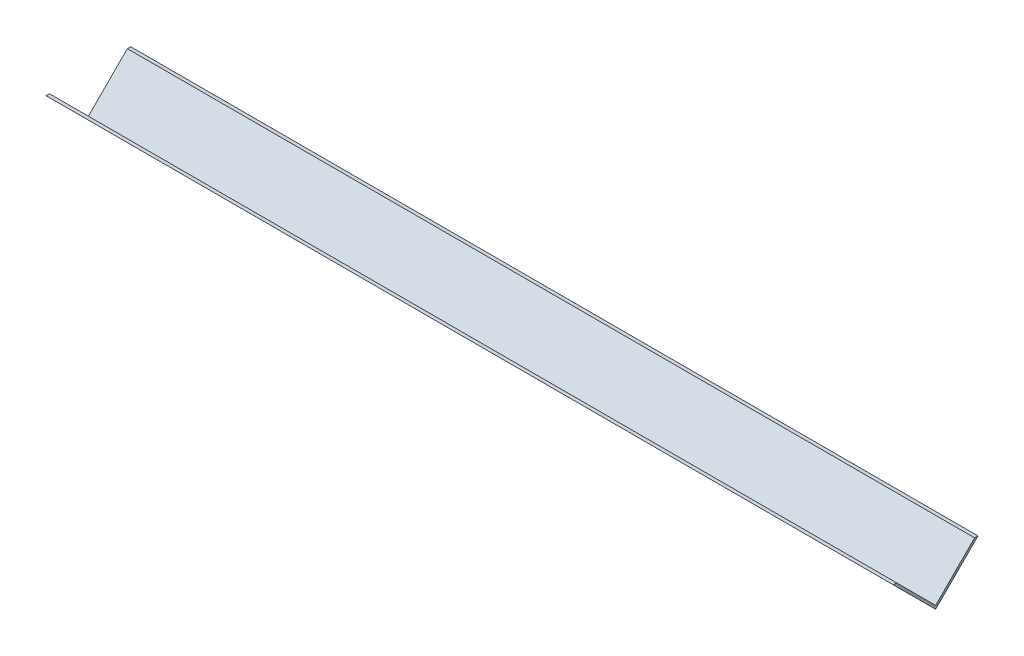
ISO-10303-21;
HEADER;
FILE_DESCRIPTION(('STEP AP214'),'2;1');
FILE_NAME('part.step','',(''),(''),'','','');
FILE_SCHEMA(('AUTOMOTIVE_DESIGN { 1 0 10303 214 1 1 1 1 }'));
ENDSEC;
DATA;
#1=APPLICATION_CONTEXT('core data for automotive mechanical design processes');
#2=APPLICATION_PROTOCOL_DEFINITION('international standard','automotive_design',2000,#1);
#3=PRODUCT_CONTEXT('',#1,'mechanical');
#4=PRODUCT('Part','Part','',(#3));
#5=PRODUCT_RELATED_PRODUCT_CATEGORY('part','',(#4));
#6=PRODUCT_DEFINITION_FORMATION('','',#4);
#7=PRODUCT_DEFINITION_CONTEXT('part definition',#1,'design');
#8=PRODUCT_DEFINITION('design','',#6,#7);
#9=PRODUCT_DEFINITION_SHAPE('','',#8);
#10=(LENGTH_UNIT() NAMED_UNIT(*) SI_UNIT(.MILLI.,.METRE.));
#11=(NAMED_UNIT(*) PLANE_ANGLE_UNIT() SI_UNIT($,.RADIAN.));
#12=(NAMED_UNIT(*) SI_UNIT($,.STERADIAN.) SOLID_ANGLE_UNIT());
#13=UNCERTAINTY_MEASURE_WITH_UNIT(LENGTH_MEASURE(1.E-05),#10,'distance_accuracy_value','');
#14=(GEOMETRIC_REPRESENTATION_CONTEXT(3) GLOBAL_UNCERTAINTY_ASSIGNED_CONTEXT((#13)) GLOBAL_UNIT_ASSIGNED_CONTEXT((#10,
#11,#12)) REPRESENTATION_CONTEXT('',''));
#15=CARTESIAN_POINT('',(0.,0.,0.));
#16=DIRECTION('',(0.,0.,1.));
#17=DIRECTION('',(1.,0.,0.));
#18=AXIS2_PLACEMENT_3D('',#15,#16,#17);
#19=CARTESIAN_POINT('',(400.,0.,0.));
#20=DIRECTION('',(0.,0.707106781186549,0.707106781186546));
#21=DIRECTION('',(0.,-0.707106781186546,0.707106781186549));
#22=AXIS2_PLACEMENT_3D('',#19,#20,#21);
#23=PLANE('',#22);
#24=DIRECTION('',(0.,0.707106781186546,-0.707106781186549));
#25=VECTOR('',#24,1.);
#26=CARTESIAN_POINT('',(0.,0.,0.));
#27=LINE('',#26,#25);
#28=CARTESIAN_POINT('',(0.,0.,0.));
#29=VERTEX_POINT('',#28);
#30=CARTESIAN_POINT('',(0.,20.,-20.0000000000001));
#31=VERTEX_POINT('',#30);
#32=EDGE_CURVE('E117',#29,#31,#27,.T.);
#33=ORIENTED_EDGE('',*,*,#32,.T.);
#34=DIRECTION('',(-1.,0.,0.));
#35=VECTOR('',#34,1.);
#36=CARTESIAN_POINT('',(400.,20.,-20.0000000000001));
#37=LINE('',#36,#35);
#38=CARTESIAN_POINT('',(400.,20.,-20.0000000000001));
#39=VERTEX_POINT('',#38);
#40=EDGE_CURVE('E11',#39,#31,#37,.T.);
#41=ORIENTED_EDGE('',*,*,#40,.F.);
#42=DIRECTION('',(0.,0.707106781186546,-0.707106781186549));
#43=VECTOR('',#42,1.);
#44=CARTESIAN_POINT('',(400.,0.,0.));
#45=LINE('',#44,#43);
#46=CARTESIAN_POINT('',(400.,0.,0.));
#47=VERTEX_POINT('',#46);
#48=EDGE_CURVE('E127',#47,#39,#45,.T.);
#49=ORIENTED_EDGE('',*,*,#48,.F.);
#50=DIRECTION('',(-1.,0.,0.));
#51=VECTOR('',#50,1.);
#52=CARTESIAN_POINT('',(400.,0.,0.));
#53=LINE('',#52,#51);
#54=EDGE_CURVE('E113',#47,#29,#53,.T.);
#55=ORIENTED_EDGE('',*,*,#54,.T.);
#56=EDGE_LOOP('',(#33,#41,#49,#55));
#57=FACE_BOUND('',#56,.T.);
#58=ADVANCED_FACE('F33',(#57),#23,.F.);
#59=CARTESIAN_POINT('',(400.,20.,-20.0000000000001));
#60=DIRECTION('',(0.,-1.,0.));
#61=DIRECTION('',(0.,0.,-1.));
#62=AXIS2_PLACEMENT_3D('',#59,#60,#61);
#63=PLANE('',#62);
#64=DIRECTION('',(0.,0.,1.));
#65=VECTOR('',#64,1.);
#66=CARTESIAN_POINT('',(0.,20.,-20.0000000000001));
#67=LINE('',#66,#65);
#68=CARTESIAN_POINT('',(0.,20.,-18.4051617191672));
#69=VERTEX_POINT('',#68);
#70=EDGE_CURVE('E120',#31,#69,#67,.T.);
#71=ORIENTED_EDGE('',*,*,#70,.T.);
#72=DIRECTION('',(-1.,0.,0.));
#73=VECTOR('',#72,1.);
#74=CARTESIAN_POINT('',(400.,20.,-18.4051617191672));
#75=LINE('',#74,#73);
#76=CARTESIAN_POINT('',(400.,20.,-18.4051617191672));
#77=VERTEX_POINT('',#76);
#78=EDGE_CURVE('E41',#77,#69,#75,.T.);
#79=ORIENTED_EDGE('',*,*,#78,.F.);
#80=DIRECTION('',(0.,0.,1.));
#81=VECTOR('',#80,1.);
#82=CARTESIAN_POINT('',(400.,20.,-20.0000000000001));
#83=LINE('',#82,#81);
#84=EDGE_CURVE('E86',#39,#77,#83,.T.);
#85=ORIENTED_EDGE('',*,*,#84,.F.);
#86=ORIENTED_EDGE('',*,*,#40,.T.);
#87=EDGE_LOOP('',(#71,#79,#85,#86));
#88=FACE_BOUND('',#87,.T.);
#89=ADVANCED_FACE('F151',(#88),#63,.F.);
#90=CARTESIAN_POINT('',(400.,20.,-18.4051617191672));
#91=DIRECTION('',(0.,-0.707106781186549,-0.707106781186546));
#92=DIRECTION('',(0.,0.707106781186546,-0.707106781186549));
#93=AXIS2_PLACEMENT_3D('',#90,#91,#92);
#94=PLANE('',#93);
#95=DIRECTION('',(0.,-0.707106781186546,0.707106781186549));
#96=VECTOR('',#95,1.);
#97=CARTESIAN_POINT('',(0.,20.,-18.4051617191672));
#98=LINE('',#97,#96);
#99=CARTESIAN_POINT('',(0.,1.59483828083292,0.));
#100=VERTEX_POINT('',#99);
#101=EDGE_CURVE('E122',#69,#100,#98,.T.);
#102=ORIENTED_EDGE('',*,*,#101,.T.);
#103=DIRECTION('',(-1.,0.,0.));
#104=VECTOR('',#103,1.);
#105=CARTESIAN_POINT('',(400.,1.59483828083292,0.));
#106=LINE('',#105,#104);
#107=CARTESIAN_POINT('',(400.,1.59483828083292,0.));
#108=VERTEX_POINT('',#107);
#109=EDGE_CURVE('E108',#108,#100,#106,.T.);
#110=ORIENTED_EDGE('',*,*,#109,.F.);
#111=DIRECTION('',(0.,-0.707106781186546,0.707106781186549));
#112=VECTOR('',#111,1.);
#113=CARTESIAN_POINT('',(400.,20.,-18.4051617191672));
#114=LINE('',#113,#112);
#115=EDGE_CURVE('E99',#77,#108,#114,.T.);
#116=ORIENTED_EDGE('',*,*,#115,.F.);
#117=ORIENTED_EDGE('',*,*,#78,.T.);
#118=EDGE_LOOP('',(#102,#110,#116,#117));
#119=FACE_BOUND('',#118,.T.);
#120=ADVANCED_FACE('F133',(#119),#94,.F.);
#121=CARTESIAN_POINT('',(400.,20.,18.4051617191672));
#122=DIRECTION('',(0.,-0.707106781186549,0.707106781186546));
#123=DIRECTION('',(0.,-0.707106781186546,-0.707106781186549));
#124=AXIS2_PLACEMENT_3D('',#121,#122,#123);
#125=PLANE('',#124);
#126=DIRECTION('',(0.,0.707106781186546,0.707106781186549));
#127=VECTOR('',#126,1.);
#128=CARTESIAN_POINT('',(0.,20.,18.4051617191672));
#129=LINE('',#128,#127);
#130=CARTESIAN_POINT('',(0.,20.,18.4051617191672));
#131=VERTEX_POINT('',#130);
#132=EDGE_CURVE('E107',#100,#131,#129,.T.);
#133=ORIENTED_EDGE('',*,*,#132,.T.);
#134=DIRECTION('',(-1.,0.,0.));
#135=VECTOR('',#134,1.);
#136=CARTESIAN_POINT('',(400.,20.,18.4051617191672));
#137=LINE('',#136,#135);
#138=CARTESIAN_POINT('',(400.,20.,18.4051617191672));
#139=VERTEX_POINT('',#138);
#140=EDGE_CURVE('E104',#139,#131,#137,.T.);
#141=ORIENTED_EDGE('',*,*,#140,.F.);
#142=DIRECTION('',(0.,0.707106781186546,0.707106781186549));
#143=VECTOR('',#142,1.);
#144=CARTESIAN_POINT('',(400.,20.,18.4051617191672));
#145=LINE('',#144,#143);
#146=EDGE_CURVE('E93',#108,#139,#145,.T.);
#147=ORIENTED_EDGE('',*,*,#146,.F.);
#148=ORIENTED_EDGE('',*,*,#109,.T.);
#149=EDGE_LOOP('',(#133,#141,#147,#148));
#150=FACE_BOUND('',#149,.T.);
#151=ADVANCED_FACE('F105',(#150),#125,.F.);
#152=CARTESIAN_POINT('',(400.,20.,20.0000000000001));
#153=DIRECTION('',(0.,-1.,0.));
#154=DIRECTION('',(0.,0.,-1.));
#155=AXIS2_PLACEMENT_3D('',#152,#153,#154);
#156=PLANE('',#155);
#157=DIRECTION('',(0.,0.,1.));
#158=VECTOR('',#157,1.);
#159=CARTESIAN_POINT('',(0.,20.,20.0000000000001));
#160=LINE('',#159,#158);
#161=CARTESIAN_POINT('',(0.,20.,20.0000000000001));
#162=VERTEX_POINT('',#161);
#163=EDGE_CURVE('E72',#131,#162,#160,.T.);
#164=ORIENTED_EDGE('',*,*,#163,.T.);
#165=DIRECTION('',(-1.,0.,0.));
#166=VECTOR('',#165,1.);
#167=CARTESIAN_POINT('',(400.,20.,20.0000000000001));
#168=LINE('',#167,#166);
#169=CARTESIAN_POINT('',(400.,20.,20.0000000000001));
#170=VERTEX_POINT('',#169);
#171=EDGE_CURVE('E109',#170,#162,#168,.T.);
#172=ORIENTED_EDGE('',*,*,#171,.F.);
#173=DIRECTION('',(0.,0.,1.));
#174=VECTOR('',#173,1.);
#175=CARTESIAN_POINT('',(400.,20.,20.0000000000001));
#176=LINE('',#175,#174);
#177=EDGE_CURVE('E97',#139,#170,#176,.T.);
#178=ORIENTED_EDGE('',*,*,#177,.F.);
#179=ORIENTED_EDGE('',*,*,#140,.T.);
#180=EDGE_LOOP('',(#164,#172,#178,#179));
#181=FACE_BOUND('',#180,.T.);
#182=ADVANCED_FACE('F111',(#181),#156,.F.);
#183=CARTESIAN_POINT('',(400.,0.,0.));
#184=DIRECTION('',(0.,0.707106781186549,-0.707106781186546));
#185=DIRECTION('',(0.,0.707106781186546,0.707106781186549));
#186=AXIS2_PLACEMENT_3D('',#183,#184,#185);
#187=PLANE('',#186);
#188=DIRECTION('',(0.,-0.707106781186546,-0.707106781186549));
#189=VECTOR('',#188,1.);
#190=CARTESIAN_POINT('',(0.,0.,0.));
#191=LINE('',#190,#189);
#192=EDGE_CURVE('E78',#162,#29,#191,.T.);
#193=ORIENTED_EDGE('',*,*,#192,.T.);
#194=ORIENTED_EDGE('',*,*,#54,.F.);
#195=DIRECTION('',(0.,-0.707106781186546,-0.707106781186549));
#196=VECTOR('',#195,1.);
#197=CARTESIAN_POINT('',(400.,0.,0.));
#198=LINE('',#197,#196);
#199=EDGE_CURVE('E49',#170,#47,#198,.T.);
#200=ORIENTED_EDGE('',*,*,#199,.F.);
#201=ORIENTED_EDGE('',*,*,#171,.T.);
#202=EDGE_LOOP('',(#193,#194,#200,#201));
#203=FACE_BOUND('',#202,.T.);
#204=ADVANCED_FACE('F140',(#203),#187,.F.);
#205=CARTESIAN_POINT('',(400.,0.,0.));
#206=DIRECTION('',(-1.,0.,0.));
#207=DIRECTION('',(0.,0.,1.));
#208=AXIS2_PLACEMENT_3D('',#205,#206,#207);
#209=PLANE('',#208);
#210=ORIENTED_EDGE('',*,*,#48,.T.);
#211=ORIENTED_EDGE('',*,*,#84,.T.);
#212=ORIENTED_EDGE('',*,*,#115,.T.);
#213=ORIENTED_EDGE('',*,*,#146,.T.);
#214=ORIENTED_EDGE('',*,*,#177,.T.);
#215=ORIENTED_EDGE('',*,*,#199,.T.);
#216=EDGE_LOOP('',(#210,#211,#212,#213,#214,#215));
#217=FACE_BOUND('',#216,.T.);
#218=ADVANCED_FACE('F95',(#217),#209,.F.);
#219=CARTESIAN_POINT('',(0.,0.,0.));
#220=DIRECTION('',(-1.,0.,0.));
#221=DIRECTION('',(0.,0.,1.));
#222=AXIS2_PLACEMENT_3D('',#219,#220,#221);
#223=PLANE('',#222);
#224=ORIENTED_EDGE('',*,*,#32,.F.);
#225=ORIENTED_EDGE('',*,*,#192,.F.);
#226=ORIENTED_EDGE('',*,*,#163,.F.);
#227=ORIENTED_EDGE('',*,*,#132,.F.);
#228=ORIENTED_EDGE('',*,*,#101,.F.);
#229=ORIENTED_EDGE('',*,*,#70,.F.);
#230=EDGE_LOOP('',(#224,#225,#226,#227,#228,#229));
#231=FACE_BOUND('',#230,.T.);
#232=ADVANCED_FACE('F136',(#231),#223,.T.);
#233=CLOSED_SHELL('',(#58,#89,#120,#151,#182,#204,#218,#232));
#234=MANIFOLD_SOLID_BREP('B2',#233);
#235=ADVANCED_BREP_SHAPE_REPRESENTATION('',(#18,#234),#14);
#236=SHAPE_DEFINITION_REPRESENTATION(#9,#235);
ENDSEC;
END-ISO-10303-21;
